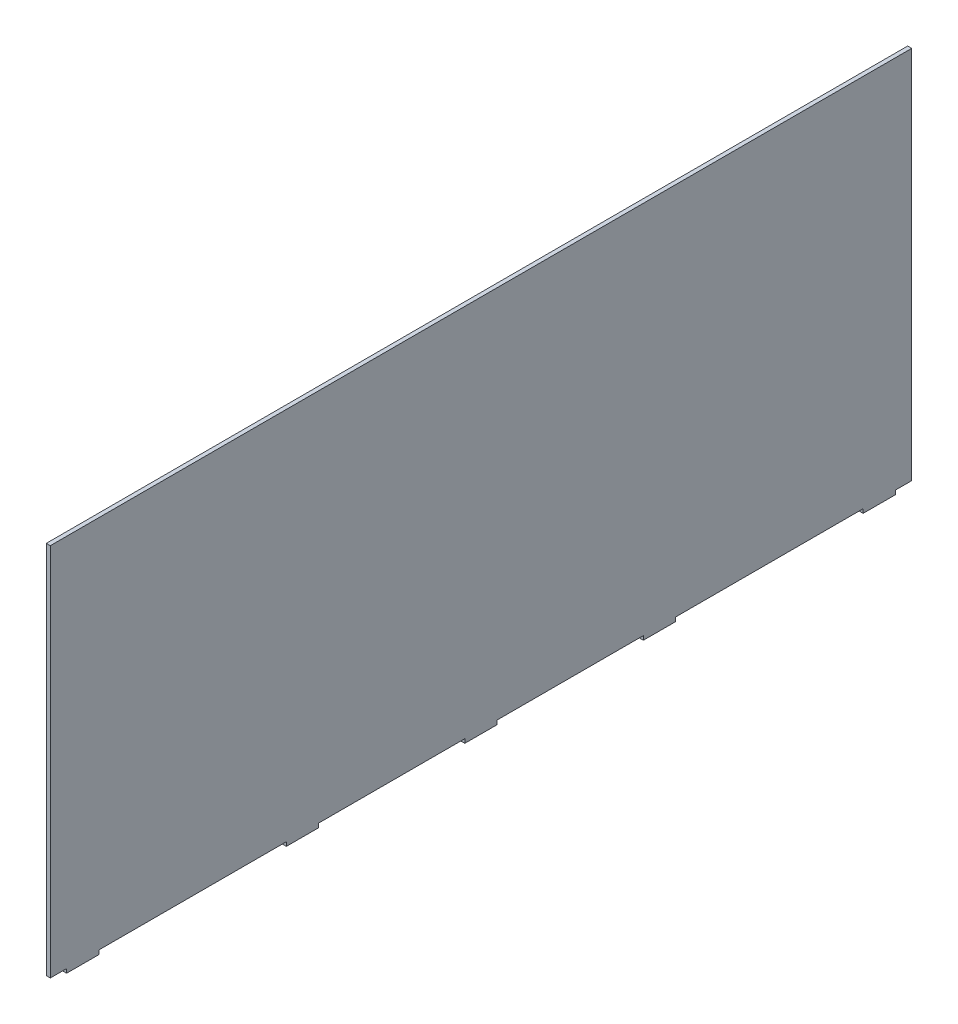
ISO-10303-21;
HEADER;
FILE_DESCRIPTION(('STEP AP214'),'2;1');
FILE_NAME('part.step','',(''),(''),'','','');
FILE_SCHEMA(('AUTOMOTIVE_DESIGN { 1 0 10303 214 1 1 1 1 }'));
ENDSEC;
DATA;
#1=APPLICATION_CONTEXT('core data for automotive mechanical design processes');
#2=APPLICATION_PROTOCOL_DEFINITION('international standard','automotive_design',2000,#1);
#3=PRODUCT_CONTEXT('',#1,'mechanical');
#4=PRODUCT('Part','Part','',(#3));
#5=PRODUCT_RELATED_PRODUCT_CATEGORY('part','',(#4));
#6=PRODUCT_DEFINITION_FORMATION('','',#4);
#7=PRODUCT_DEFINITION_CONTEXT('part definition',#1,'design');
#8=PRODUCT_DEFINITION('design','',#6,#7);
#9=PRODUCT_DEFINITION_SHAPE('','',#8);
#10=(LENGTH_UNIT() NAMED_UNIT(*) SI_UNIT(.MILLI.,.METRE.));
#11=(NAMED_UNIT(*) PLANE_ANGLE_UNIT() SI_UNIT($,.RADIAN.));
#12=(NAMED_UNIT(*) SI_UNIT($,.STERADIAN.) SOLID_ANGLE_UNIT());
#13=UNCERTAINTY_MEASURE_WITH_UNIT(LENGTH_MEASURE(1.E-05),#10,'distance_accuracy_value','');
#14=(GEOMETRIC_REPRESENTATION_CONTEXT(3) GLOBAL_UNCERTAINTY_ASSIGNED_CONTEXT((#13)) GLOBAL_UNIT_ASSIGNED_CONTEXT((#10,
#11,#12)) REPRESENTATION_CONTEXT('',''));
#15=CARTESIAN_POINT('',(0.,0.,0.));
#16=DIRECTION('',(0.,0.,1.));
#17=DIRECTION('',(1.,0.,0.));
#18=AXIS2_PLACEMENT_3D('',#15,#16,#17);
#19=CARTESIAN_POINT('',(3.175,0.,300.04258));
#20=DIRECTION('',(0.,0.,-1.));
#21=DIRECTION('',(-1.,0.,0.));
#22=AXIS2_PLACEMENT_3D('',#19,#20,#21);
#23=PLANE('',#22);
#24=DIRECTION('',(0.,-1.,0.));
#25=VECTOR('',#24,1.);
#26=CARTESIAN_POINT('',(0.,0.,300.04258));
#27=LINE('',#26,#25);
#28=CARTESIAN_POINT('',(0.,-145.415,300.04258));
#29=VERTEX_POINT('',#28);
#30=CARTESIAN_POINT('',(0.,-148.59,300.04258));
#31=VERTEX_POINT('',#30);
#32=EDGE_CURVE('E227',#29,#31,#27,.T.);
#33=ORIENTED_EDGE('',*,*,#32,.F.);
#34=DIRECTION('',(-1.,0.,0.));
#35=VECTOR('',#34,1.);
#36=CARTESIAN_POINT('',(3.175,-145.415,300.04258));
#37=LINE('',#36,#35);
#38=CARTESIAN_POINT('',(3.175,-145.415,300.04258));
#39=VERTEX_POINT('',#38);
#40=EDGE_CURVE('E11',#39,#29,#37,.T.);
#41=ORIENTED_EDGE('',*,*,#40,.F.);
#42=DIRECTION('',(0.,-1.,0.));
#43=VECTOR('',#42,1.);
#44=CARTESIAN_POINT('',(3.175,0.,300.04258));
#45=LINE('',#44,#43);
#46=CARTESIAN_POINT('',(3.175,-148.59,300.04258));
#47=VERTEX_POINT('',#46);
#48=EDGE_CURVE('E416',#39,#47,#45,.T.);
#49=ORIENTED_EDGE('',*,*,#48,.T.);
#50=DIRECTION('',(-1.,0.,0.));
#51=VECTOR('',#50,1.);
#52=CARTESIAN_POINT('',(3.175,-148.59,300.04258));
#53=LINE('',#52,#51);
#54=EDGE_CURVE('E135',#47,#31,#53,.T.);
#55=ORIENTED_EDGE('',*,*,#54,.T.);
#56=EDGE_LOOP('',(#33,#41,#49,#55));
#57=FACE_BOUND('',#56,.T.);
#58=ADVANCED_FACE('F36',(#57),#23,.T.);
#59=CARTESIAN_POINT('',(3.175,-145.415,0.));
#60=DIRECTION('',(0.,1.,0.));
#61=DIRECTION('',(0.,0.,1.));
#62=AXIS2_PLACEMENT_3D('',#59,#60,#61);
#63=PLANE('',#62);
#64=DIRECTION('',(0.,0.,-1.));
#65=VECTOR('',#64,1.);
#66=CARTESIAN_POINT('',(0.,-145.415,0.));
#67=LINE('',#66,#65);
#68=CARTESIAN_POINT('',(0.,-145.415,152.872439999999));
#69=VERTEX_POINT('',#68);
#70=EDGE_CURVE('E230',#29,#69,#67,.T.);
#71=ORIENTED_EDGE('',*,*,#70,.T.);
#72=DIRECTION('',(-1.,0.,0.));
#73=VECTOR('',#72,1.);
#74=CARTESIAN_POINT('',(3.175,-145.415,152.872439999999));
#75=LINE('',#74,#73);
#76=CARTESIAN_POINT('',(3.175,-145.415,152.872439999999));
#77=VERTEX_POINT('',#76);
#78=EDGE_CURVE('E44',#77,#69,#75,.T.);
#79=ORIENTED_EDGE('',*,*,#78,.F.);
#80=DIRECTION('',(0.,0.,-1.));
#81=VECTOR('',#80,1.);
#82=CARTESIAN_POINT('',(3.175,-145.415,0.));
#83=LINE('',#82,#81);
#84=EDGE_CURVE('E352',#39,#77,#83,.T.);
#85=ORIENTED_EDGE('',*,*,#84,.F.);
#86=ORIENTED_EDGE('',*,*,#40,.T.);
#87=EDGE_LOOP('',(#71,#79,#85,#86));
#88=FACE_BOUND('',#87,.T.);
#89=ADVANCED_FACE('F407',(#88),#63,.F.);
#90=CARTESIAN_POINT('',(3.175,0.,152.872439999999));
#91=DIRECTION('',(0.,0.,-1.));
#92=DIRECTION('',(-1.,0.,0.));
#93=AXIS2_PLACEMENT_3D('',#90,#91,#92);
#94=PLANE('',#93);
#95=DIRECTION('',(0.,-1.,0.));
#96=VECTOR('',#95,1.);
#97=CARTESIAN_POINT('',(0.,0.,152.872439999999));
#98=LINE('',#97,#96);
#99=CARTESIAN_POINT('',(0.,-148.59,152.872439999999));
#100=VERTEX_POINT('',#99);
#101=EDGE_CURVE('E232',#69,#100,#98,.T.);
#102=ORIENTED_EDGE('',*,*,#101,.T.);
#103=DIRECTION('',(-1.,0.,0.));
#104=VECTOR('',#103,1.);
#105=CARTESIAN_POINT('',(3.175,-148.59,152.872439999999));
#106=LINE('',#105,#104);
#107=CARTESIAN_POINT('',(3.175,-148.59,152.872439999999));
#108=VERTEX_POINT('',#107);
#109=EDGE_CURVE('E324',#108,#100,#106,.T.);
#110=ORIENTED_EDGE('',*,*,#109,.F.);
#111=DIRECTION('',(0.,-1.,0.));
#112=VECTOR('',#111,1.);
#113=CARTESIAN_POINT('',(3.175,0.,152.872439999999));
#114=LINE('',#113,#112);
#115=EDGE_CURVE('E333',#77,#108,#114,.T.);
#116=ORIENTED_EDGE('',*,*,#115,.F.);
#117=ORIENTED_EDGE('',*,*,#78,.T.);
#118=EDGE_LOOP('',(#102,#110,#116,#117));
#119=FACE_BOUND('',#118,.T.);
#120=ADVANCED_FACE('F331',(#119),#94,.F.);
#121=CARTESIAN_POINT('',(3.175,-148.59,0.));
#122=DIRECTION('',(0.,1.,0.));
#123=DIRECTION('',(0.,0.,1.));
#124=AXIS2_PLACEMENT_3D('',#121,#122,#123);
#125=PLANE('',#124);
#126=DIRECTION('',(0.,0.,-1.));
#127=VECTOR('',#126,1.);
#128=CARTESIAN_POINT('',(0.,-148.59,0.));
#129=LINE('',#128,#127);
#130=CARTESIAN_POINT('',(0.,-148.59,127.472439999999));
#131=VERTEX_POINT('',#130);
#132=EDGE_CURVE('E236',#100,#131,#129,.T.);
#133=ORIENTED_EDGE('',*,*,#132,.T.);
#134=DIRECTION('',(-1.,0.,0.));
#135=VECTOR('',#134,1.);
#136=CARTESIAN_POINT('',(3.175,-148.59,127.472439999999));
#137=LINE('',#136,#135);
#138=CARTESIAN_POINT('',(3.175,-148.59,127.472439999999));
#139=VERTEX_POINT('',#138);
#140=EDGE_CURVE('E322',#139,#131,#137,.T.);
#141=ORIENTED_EDGE('',*,*,#140,.F.);
#142=DIRECTION('',(0.,0.,-1.));
#143=VECTOR('',#142,1.);
#144=CARTESIAN_POINT('',(3.175,-148.59,0.));
#145=LINE('',#144,#143);
#146=EDGE_CURVE('E346',#108,#139,#145,.T.);
#147=ORIENTED_EDGE('',*,*,#146,.F.);
#148=ORIENTED_EDGE('',*,*,#109,.T.);
#149=EDGE_LOOP('',(#133,#141,#147,#148));
#150=FACE_BOUND('',#149,.T.);
#151=ADVANCED_FACE('F343',(#150),#125,.F.);
#152=CARTESIAN_POINT('',(3.175,0.,127.472439999999));
#153=DIRECTION('',(0.,0.,-1.));
#154=DIRECTION('',(-1.,0.,0.));
#155=AXIS2_PLACEMENT_3D('',#152,#153,#154);
#156=PLANE('',#155);
#157=DIRECTION('',(0.,-1.,0.));
#158=VECTOR('',#157,1.);
#159=CARTESIAN_POINT('',(0.,0.,127.472439999999));
#160=LINE('',#159,#158);
#161=CARTESIAN_POINT('',(0.,-145.415,127.472439999999));
#162=VERTEX_POINT('',#161);
#163=EDGE_CURVE('E239',#162,#131,#160,.T.);
#164=ORIENTED_EDGE('',*,*,#163,.F.);
#165=DIRECTION('',(-1.,0.,0.));
#166=VECTOR('',#165,1.);
#167=CARTESIAN_POINT('',(3.175,-145.415,127.472439999999));
#168=LINE('',#167,#166);
#169=CARTESIAN_POINT('',(3.175,-145.415,127.472439999999));
#170=VERTEX_POINT('',#169);
#171=EDGE_CURVE('E320',#170,#162,#168,.T.);
#172=ORIENTED_EDGE('',*,*,#171,.F.);
#173=DIRECTION('',(0.,-1.,0.));
#174=VECTOR('',#173,1.);
#175=CARTESIAN_POINT('',(3.175,0.,127.472439999999));
#176=LINE('',#175,#174);
#177=EDGE_CURVE('E348',#170,#139,#176,.T.);
#178=ORIENTED_EDGE('',*,*,#177,.T.);
#179=ORIENTED_EDGE('',*,*,#140,.T.);
#180=EDGE_LOOP('',(#164,#172,#178,#179));
#181=FACE_BOUND('',#180,.T.);
#182=ADVANCED_FACE('F485',(#181),#156,.T.);
#183=CARTESIAN_POINT('',(0.,-145.415,12.7000000000002));
#184=VERTEX_POINT('',#183);
#185=EDGE_CURVE('E234',#162,#184,#67,.T.);
#186=ORIENTED_EDGE('',*,*,#185,.T.);
#187=DIRECTION('',(-1.,0.,0.));
#188=VECTOR('',#187,1.);
#189=CARTESIAN_POINT('',(3.175,-145.415,12.7000000000002));
#190=LINE('',#189,#188);
#191=CARTESIAN_POINT('',(3.175,-145.415,12.7000000000002));
#192=VERTEX_POINT('',#191);
#193=EDGE_CURVE('E317',#192,#184,#190,.T.);
#194=ORIENTED_EDGE('',*,*,#193,.F.);
#195=EDGE_CURVE('E350',#170,#192,#83,.T.);
#196=ORIENTED_EDGE('',*,*,#195,.F.);
#197=ORIENTED_EDGE('',*,*,#171,.T.);
#198=EDGE_LOOP('',(#186,#194,#196,#197));
#199=FACE_BOUND('',#198,.T.);
#200=ADVANCED_FACE('F412',(#199),#63,.F.);
#201=CARTESIAN_POINT('',(3.175,0.,12.7000000000002));
#202=DIRECTION('',(0.,0.,-1.));
#203=DIRECTION('',(-1.,0.,0.));
#204=AXIS2_PLACEMENT_3D('',#201,#202,#203);
#205=PLANE('',#204);
#206=DIRECTION('',(0.,-1.,0.));
#207=VECTOR('',#206,1.);
#208=CARTESIAN_POINT('',(0.,0.,12.7000000000002));
#209=LINE('',#208,#207);
#210=CARTESIAN_POINT('',(0.,-148.59,12.7000000000002));
#211=VERTEX_POINT('',#210);
#212=EDGE_CURVE('E242',#184,#211,#209,.T.);
#213=ORIENTED_EDGE('',*,*,#212,.T.);
#214=DIRECTION('',(-1.,0.,0.));
#215=VECTOR('',#214,1.);
#216=CARTESIAN_POINT('',(3.175,-148.59,12.7000000000002));
#217=LINE('',#216,#215);
#218=CARTESIAN_POINT('',(3.175,-148.59,12.7000000000002));
#219=VERTEX_POINT('',#218);
#220=EDGE_CURVE('E314',#219,#211,#217,.T.);
#221=ORIENTED_EDGE('',*,*,#220,.F.);
#222=DIRECTION('',(0.,-1.,0.));
#223=VECTOR('',#222,1.);
#224=CARTESIAN_POINT('',(3.175,0.,12.7000000000002));
#225=LINE('',#224,#223);
#226=EDGE_CURVE('E356',#192,#219,#225,.T.);
#227=ORIENTED_EDGE('',*,*,#226,.F.);
#228=ORIENTED_EDGE('',*,*,#193,.T.);
#229=EDGE_LOOP('',(#213,#221,#227,#228));
#230=FACE_BOUND('',#229,.T.);
#231=ADVANCED_FACE('F463',(#230),#205,.F.);
#232=CARTESIAN_POINT('',(3.175,-148.59,0.));
#233=DIRECTION('',(0.,1.,0.));
#234=DIRECTION('',(0.,0.,1.));
#235=AXIS2_PLACEMENT_3D('',#232,#233,#234);
#236=PLANE('',#235);
#237=DIRECTION('',(0.,0.,-1.));
#238=VECTOR('',#237,1.);
#239=CARTESIAN_POINT('',(0.,-148.59,0.));
#240=LINE('',#239,#238);
#241=CARTESIAN_POINT('',(0.,-148.59,-12.7));
#242=VERTEX_POINT('',#241);
#243=EDGE_CURVE('E244',#211,#242,#240,.T.);
#244=ORIENTED_EDGE('',*,*,#243,.T.);
#245=DIRECTION('',(-1.,0.,0.));
#246=VECTOR('',#245,1.);
#247=CARTESIAN_POINT('',(3.175,-148.59,-12.7));
#248=LINE('',#247,#246);
#249=CARTESIAN_POINT('',(3.175,-148.59,-12.7));
#250=VERTEX_POINT('',#249);
#251=EDGE_CURVE('E312',#250,#242,#248,.T.);
#252=ORIENTED_EDGE('',*,*,#251,.F.);
#253=DIRECTION('',(0.,0.,-1.));
#254=VECTOR('',#253,1.);
#255=CARTESIAN_POINT('',(3.175,-148.59,0.));
#256=LINE('',#255,#254);
#257=EDGE_CURVE('E358',#219,#250,#256,.T.);
#258=ORIENTED_EDGE('',*,*,#257,.F.);
#259=ORIENTED_EDGE('',*,*,#220,.T.);
#260=EDGE_LOOP('',(#244,#252,#258,#259));
#261=FACE_BOUND('',#260,.T.);
#262=ADVANCED_FACE('F469',(#261),#236,.F.);
#263=CARTESIAN_POINT('',(3.175,1.6653345369352E-12,-12.6999999999807));
#264=DIRECTION('',(0.,1.31128703695884E-13,-1.));
#265=DIRECTION('',(0.,1.,1.31128703695884E-13));
#266=AXIS2_PLACEMENT_3D('',#263,#264,#265);
#267=PLANE('',#266);
#268=DIRECTION('',(0.,-1.,-1.31128703695884E-13));
#269=VECTOR('',#268,1.);
#270=CARTESIAN_POINT('',(0.,1.6653345369352E-12,-12.6999999999807));
#271=LINE('',#270,#269);
#272=CARTESIAN_POINT('',(0.,-145.415,-12.6999999999998));
#273=VERTEX_POINT('',#272);
#274=EDGE_CURVE('E247',#273,#242,#271,.T.);
#275=ORIENTED_EDGE('',*,*,#274,.F.);
#276=DIRECTION('',(-1.,0.,0.));
#277=VECTOR('',#276,1.);
#278=CARTESIAN_POINT('',(3.175,-145.415,-12.6999999999998));
#279=LINE('',#278,#277);
#280=CARTESIAN_POINT('',(3.175,-145.415,-12.6999999999998));
#281=VERTEX_POINT('',#280);
#282=EDGE_CURVE('E310',#281,#273,#279,.T.);
#283=ORIENTED_EDGE('',*,*,#282,.F.);
#284=DIRECTION('',(0.,-1.,-1.31128703695884E-13));
#285=VECTOR('',#284,1.);
#286=CARTESIAN_POINT('',(3.175,1.6653345369352E-12,-12.6999999999807));
#287=LINE('',#286,#285);
#288=EDGE_CURVE('E360',#281,#250,#287,.T.);
#289=ORIENTED_EDGE('',*,*,#288,.T.);
#290=ORIENTED_EDGE('',*,*,#251,.T.);
#291=EDGE_LOOP('',(#275,#283,#289,#290));
#292=FACE_BOUND('',#291,.T.);
#293=ADVANCED_FACE('F472',(#292),#267,.T.);
#294=CARTESIAN_POINT('',(0.,-145.415,-127.472439999999));
#295=VERTEX_POINT('',#294);
#296=EDGE_CURVE('E250',#273,#295,#67,.T.);
#297=ORIENTED_EDGE('',*,*,#296,.T.);
#298=DIRECTION('',(-1.,0.,0.));
#299=VECTOR('',#298,1.);
#300=CARTESIAN_POINT('',(3.175,-145.415,-127.472439999999));
#301=LINE('',#300,#299);
#302=CARTESIAN_POINT('',(3.175,-145.415,-127.472439999999));
#303=VERTEX_POINT('',#302);
#304=EDGE_CURVE('E307',#303,#295,#301,.T.);
#305=ORIENTED_EDGE('',*,*,#304,.F.);
#306=EDGE_CURVE('E363',#281,#303,#83,.T.);
#307=ORIENTED_EDGE('',*,*,#306,.F.);
#308=ORIENTED_EDGE('',*,*,#282,.T.);
#309=EDGE_LOOP('',(#297,#305,#307,#308));
#310=FACE_BOUND('',#309,.T.);
#311=ADVANCED_FACE('F426',(#310),#63,.F.);
#312=CARTESIAN_POINT('',(3.175,0.,-127.472439999999));
#313=DIRECTION('',(0.,0.,-1.));
#314=DIRECTION('',(-1.,0.,0.));
#315=AXIS2_PLACEMENT_3D('',#312,#313,#314);
#316=PLANE('',#315);
#317=DIRECTION('',(0.,-1.,0.));
#318=VECTOR('',#317,1.);
#319=CARTESIAN_POINT('',(0.,0.,-127.472439999999));
#320=LINE('',#319,#318);
#321=CARTESIAN_POINT('',(0.,-148.59,-127.472439999999));
#322=VERTEX_POINT('',#321);
#323=EDGE_CURVE('E251',#295,#322,#320,.T.);
#324=ORIENTED_EDGE('',*,*,#323,.T.);
#325=DIRECTION('',(-1.,0.,0.));
#326=VECTOR('',#325,1.);
#327=CARTESIAN_POINT('',(3.175,-148.59,-127.472439999999));
#328=LINE('',#327,#326);
#329=CARTESIAN_POINT('',(3.175,-148.59,-127.472439999999));
#330=VERTEX_POINT('',#329);
#331=EDGE_CURVE('E304',#330,#322,#328,.T.);
#332=ORIENTED_EDGE('',*,*,#331,.F.);
#333=DIRECTION('',(0.,-1.,0.));
#334=VECTOR('',#333,1.);
#335=CARTESIAN_POINT('',(3.175,0.,-127.472439999999));
#336=LINE('',#335,#334);
#337=EDGE_CURVE('E364',#303,#330,#336,.T.);
#338=ORIENTED_EDGE('',*,*,#337,.F.);
#339=ORIENTED_EDGE('',*,*,#304,.T.);
#340=EDGE_LOOP('',(#324,#332,#338,#339));
#341=FACE_BOUND('',#340,.T.);
#342=ADVANCED_FACE('F430',(#341),#316,.F.);
#343=CARTESIAN_POINT('',(3.175,-148.59,0.));
#344=DIRECTION('',(0.,1.,0.));
#345=DIRECTION('',(0.,0.,1.));
#346=AXIS2_PLACEMENT_3D('',#343,#344,#345);
#347=PLANE('',#346);
#348=DIRECTION('',(0.,0.,-1.));
#349=VECTOR('',#348,1.);
#350=CARTESIAN_POINT('',(0.,-148.59,0.));
#351=LINE('',#350,#349);
#352=CARTESIAN_POINT('',(0.,-148.59,-152.872439999999));
#353=VERTEX_POINT('',#352);
#354=EDGE_CURVE('E253',#322,#353,#351,.T.);
#355=ORIENTED_EDGE('',*,*,#354,.T.);
#356=DIRECTION('',(-1.,0.,0.));
#357=VECTOR('',#356,1.);
#358=CARTESIAN_POINT('',(3.175,-148.59,-152.872439999999));
#359=LINE('',#358,#357);
#360=CARTESIAN_POINT('',(3.175,-148.59,-152.872439999999));
#361=VERTEX_POINT('',#360);
#362=EDGE_CURVE('E302',#361,#353,#359,.T.);
#363=ORIENTED_EDGE('',*,*,#362,.F.);
#364=DIRECTION('',(0.,0.,-1.));
#365=VECTOR('',#364,1.);
#366=CARTESIAN_POINT('',(3.175,-148.59,0.));
#367=LINE('',#366,#365);
#368=EDGE_CURVE('E366',#330,#361,#367,.T.);
#369=ORIENTED_EDGE('',*,*,#368,.F.);
#370=ORIENTED_EDGE('',*,*,#331,.T.);
#371=EDGE_LOOP('',(#355,#363,#369,#370));
#372=FACE_BOUND('',#371,.T.);
#373=ADVANCED_FACE('F435',(#372),#347,.F.);
#374=CARTESIAN_POINT('',(3.175,0.,-152.872439999999));
#375=DIRECTION('',(0.,0.,-1.));
#376=DIRECTION('',(-1.,0.,0.));
#377=AXIS2_PLACEMENT_3D('',#374,#375,#376);
#378=PLANE('',#377);
#379=DIRECTION('',(0.,-1.,0.));
#380=VECTOR('',#379,1.);
#381=CARTESIAN_POINT('',(0.,0.,-152.872439999999));
#382=LINE('',#381,#380);
#383=CARTESIAN_POINT('',(0.,-145.415,-152.872439999999));
#384=VERTEX_POINT('',#383);
#385=EDGE_CURVE('E256',#384,#353,#382,.T.);
#386=ORIENTED_EDGE('',*,*,#385,.F.);
#387=DIRECTION('',(-1.,0.,0.));
#388=VECTOR('',#387,1.);
#389=CARTESIAN_POINT('',(3.175,-145.415,-152.872439999999));
#390=LINE('',#389,#388);
#391=CARTESIAN_POINT('',(3.175,-145.415,-152.872439999999));
#392=VERTEX_POINT('',#391);
#393=EDGE_CURVE('E300',#392,#384,#390,.T.);
#394=ORIENTED_EDGE('',*,*,#393,.F.);
#395=DIRECTION('',(0.,-1.,0.));
#396=VECTOR('',#395,1.);
#397=CARTESIAN_POINT('',(3.175,0.,-152.872439999999));
#398=LINE('',#397,#396);
#399=EDGE_CURVE('E368',#392,#361,#398,.T.);
#400=ORIENTED_EDGE('',*,*,#399,.T.);
#401=ORIENTED_EDGE('',*,*,#362,.T.);
#402=EDGE_LOOP('',(#386,#394,#400,#401));
#403=FACE_BOUND('',#402,.T.);
#404=ADVANCED_FACE('F441',(#403),#378,.T.);
#405=CARTESIAN_POINT('',(0.,-145.415,-300.04258));
#406=VERTEX_POINT('',#405);
#407=EDGE_CURVE('E233',#384,#406,#67,.T.);
#408=ORIENTED_EDGE('',*,*,#407,.T.);
#409=DIRECTION('',(-1.,0.,0.));
#410=VECTOR('',#409,1.);
#411=CARTESIAN_POINT('',(3.175,-145.415,-300.04258));
#412=LINE('',#411,#410);
#413=CARTESIAN_POINT('',(3.175,-145.415,-300.04258));
#414=VERTEX_POINT('',#413);
#415=EDGE_CURVE('E297',#414,#406,#412,.T.);
#416=ORIENTED_EDGE('',*,*,#415,.F.);
#417=EDGE_CURVE('E371',#392,#414,#83,.T.);
#418=ORIENTED_EDGE('',*,*,#417,.F.);
#419=ORIENTED_EDGE('',*,*,#393,.T.);
#420=EDGE_LOOP('',(#408,#416,#418,#419));
#421=FACE_BOUND('',#420,.T.);
#422=ADVANCED_FACE('F413',(#421),#63,.F.);
#423=CARTESIAN_POINT('',(3.175,0.,-300.04258));
#424=DIRECTION('',(0.,0.,-1.));
#425=DIRECTION('',(-1.,0.,0.));
#426=AXIS2_PLACEMENT_3D('',#423,#424,#425);
#427=PLANE('',#426);
#428=DIRECTION('',(0.,-1.,0.));
#429=VECTOR('',#428,1.);
#430=CARTESIAN_POINT('',(0.,0.,-300.04258));
#431=LINE('',#430,#429);
#432=CARTESIAN_POINT('',(0.,-148.59,-300.04258));
#433=VERTEX_POINT('',#432);
#434=EDGE_CURVE('E259',#406,#433,#431,.T.);
#435=ORIENTED_EDGE('',*,*,#434,.T.);
#436=DIRECTION('',(-1.,0.,0.));
#437=VECTOR('',#436,1.);
#438=CARTESIAN_POINT('',(3.175,-148.59,-300.04258));
#439=LINE('',#438,#437);
#440=CARTESIAN_POINT('',(3.175,-148.59,-300.04258));
#441=VERTEX_POINT('',#440);
#442=EDGE_CURVE('E294',#441,#433,#439,.T.);
#443=ORIENTED_EDGE('',*,*,#442,.F.);
#444=DIRECTION('',(0.,-1.,0.));
#445=VECTOR('',#444,1.);
#446=CARTESIAN_POINT('',(3.175,0.,-300.04258));
#447=LINE('',#446,#445);
#448=EDGE_CURVE('E372',#414,#441,#447,.T.);
#449=ORIENTED_EDGE('',*,*,#448,.F.);
#450=ORIENTED_EDGE('',*,*,#415,.T.);
#451=EDGE_LOOP('',(#435,#443,#449,#450));
#452=FACE_BOUND('',#451,.T.);
#453=ADVANCED_FACE('F448',(#452),#427,.F.);
#454=CARTESIAN_POINT('',(3.175,-148.59,0.));
#455=DIRECTION('',(0.,1.,0.));
#456=DIRECTION('',(0.,0.,1.));
#457=AXIS2_PLACEMENT_3D('',#454,#455,#456);
#458=PLANE('',#457);
#459=DIRECTION('',(0.,0.,-1.));
#460=VECTOR('',#459,1.);
#461=CARTESIAN_POINT('',(0.,-148.59,0.));
#462=LINE('',#461,#460);
#463=CARTESIAN_POINT('',(0.,-148.59,-325.44258));
#464=VERTEX_POINT('',#463);
#465=EDGE_CURVE('E261',#433,#464,#462,.T.);
#466=ORIENTED_EDGE('',*,*,#465,.T.);
#467=DIRECTION('',(-1.,0.,0.));
#468=VECTOR('',#467,1.);
#469=CARTESIAN_POINT('',(3.175,-148.59,-325.44258));
#470=LINE('',#469,#468);
#471=CARTESIAN_POINT('',(3.175,-148.59,-325.44258));
#472=VERTEX_POINT('',#471);
#473=EDGE_CURVE('E292',#472,#464,#470,.T.);
#474=ORIENTED_EDGE('',*,*,#473,.F.);
#475=DIRECTION('',(0.,0.,-1.));
#476=VECTOR('',#475,1.);
#477=CARTESIAN_POINT('',(3.175,-148.59,0.));
#478=LINE('',#477,#476);
#479=EDGE_CURVE('E224',#441,#472,#478,.T.);
#480=ORIENTED_EDGE('',*,*,#479,.F.);
#481=ORIENTED_EDGE('',*,*,#442,.T.);
#482=EDGE_LOOP('',(#466,#474,#480,#481));
#483=FACE_BOUND('',#482,.T.);
#484=ADVANCED_FACE('F452',(#483),#458,.F.);
#485=CARTESIAN_POINT('',(3.175,3.98298727333189E-11,-325.442579999982));
#486=DIRECTION('',(0.,1.22386790116159E-13,-1.));
#487=DIRECTION('',(0.,1.,1.22386790116159E-13));
#488=AXIS2_PLACEMENT_3D('',#485,#486,#487);
#489=PLANE('',#488);
#490=DIRECTION('',(0.,-1.,-1.22386790116159E-13));
#491=VECTOR('',#490,1.);
#492=CARTESIAN_POINT('',(0.,3.98298727333189E-11,-325.442579999982));
#493=LINE('',#492,#491);
#494=CARTESIAN_POINT('',(0.,-145.415,-325.44258));
#495=VERTEX_POINT('',#494);
#496=EDGE_CURVE('E264',#495,#464,#493,.T.);
#497=ORIENTED_EDGE('',*,*,#496,.F.);
#498=DIRECTION('',(-1.,0.,0.));
#499=VECTOR('',#498,1.);
#500=CARTESIAN_POINT('',(3.175,-145.415,-325.44258));
#501=LINE('',#500,#499);
#502=CARTESIAN_POINT('',(3.175,-145.415,-325.44258));
#503=VERTEX_POINT('',#502);
#504=EDGE_CURVE('E290',#503,#495,#501,.T.);
#505=ORIENTED_EDGE('',*,*,#504,.F.);
#506=DIRECTION('',(0.,-1.,-1.22386790116159E-13));
#507=VECTOR('',#506,1.);
#508=CARTESIAN_POINT('',(3.175,3.98298727333189E-11,-325.442579999982));
#509=LINE('',#508,#507);
#510=EDGE_CURVE('E374',#503,#472,#509,.T.);
#511=ORIENTED_EDGE('',*,*,#510,.T.);
#512=ORIENTED_EDGE('',*,*,#473,.T.);
#513=EDGE_LOOP('',(#497,#505,#511,#512));
#514=FACE_BOUND('',#513,.T.);
#515=ADVANCED_FACE('F456',(#514),#489,.T.);
#516=CARTESIAN_POINT('',(3.175,-145.415,0.));
#517=DIRECTION('',(0.,1.,0.));
#518=DIRECTION('',(0.,0.,1.));
#519=AXIS2_PLACEMENT_3D('',#516,#517,#518);
#520=PLANE('',#519);
#521=DIRECTION('',(0.,0.,-1.));
#522=VECTOR('',#521,1.);
#523=CARTESIAN_POINT('',(0.,-145.415,0.));
#524=LINE('',#523,#522);
#525=CARTESIAN_POINT('',(0.,-145.415,-338.201));
#526=VERTEX_POINT('',#525);
#527=EDGE_CURVE('E268',#495,#526,#524,.T.);
#528=ORIENTED_EDGE('',*,*,#527,.T.);
#529=DIRECTION('',(-1.,0.,0.));
#530=VECTOR('',#529,1.);
#531=CARTESIAN_POINT('',(3.175,-145.415,-338.201));
#532=LINE('',#531,#530);
#533=CARTESIAN_POINT('',(3.175,-145.415,-338.201));
#534=VERTEX_POINT('',#533);
#535=EDGE_CURVE('E288',#534,#526,#532,.T.);
#536=ORIENTED_EDGE('',*,*,#535,.F.);
#537=DIRECTION('',(0.,0.,-1.));
#538=VECTOR('',#537,1.);
#539=CARTESIAN_POINT('',(3.175,-145.415,0.));
#540=LINE('',#539,#538);
#541=EDGE_CURVE('E377',#503,#534,#540,.T.);
#542=ORIENTED_EDGE('',*,*,#541,.F.);
#543=ORIENTED_EDGE('',*,*,#504,.T.);
#544=EDGE_LOOP('',(#528,#536,#542,#543));
#545=FACE_BOUND('',#544,.T.);
#546=ADVANCED_FACE('F458',(#545),#520,.F.);
#547=CARTESIAN_POINT('',(3.175,0.,-338.201));
#548=DIRECTION('',(0.,0.,-1.));
#549=DIRECTION('',(-1.,0.,0.));
#550=AXIS2_PLACEMENT_3D('',#547,#548,#549);
#551=PLANE('',#550);
#552=DIRECTION('',(0.,-1.,0.));
#553=VECTOR('',#552,1.);
#554=CARTESIAN_POINT('',(0.,0.,-338.201));
#555=LINE('',#554,#553);
#556=CARTESIAN_POINT('',(0.,148.59,-338.201));
#557=VERTEX_POINT('',#556);
#558=EDGE_CURVE('E271',#557,#526,#555,.T.);
#559=ORIENTED_EDGE('',*,*,#558,.F.);
#560=DIRECTION('',(-1.,0.,0.));
#561=VECTOR('',#560,1.);
#562=CARTESIAN_POINT('',(3.175,148.59,-338.201));
#563=LINE('',#562,#561);
#564=CARTESIAN_POINT('',(3.175,148.59,-338.201));
#565=VERTEX_POINT('',#564);
#566=EDGE_CURVE('E286',#565,#557,#563,.T.);
#567=ORIENTED_EDGE('',*,*,#566,.F.);
#568=DIRECTION('',(0.,-1.,0.));
#569=VECTOR('',#568,1.);
#570=CARTESIAN_POINT('',(3.175,0.,-338.201));
#571=LINE('',#570,#569);
#572=EDGE_CURVE('E379',#565,#534,#571,.T.);
#573=ORIENTED_EDGE('',*,*,#572,.T.);
#574=ORIENTED_EDGE('',*,*,#535,.T.);
#575=EDGE_LOOP('',(#559,#567,#573,#574));
#576=FACE_BOUND('',#575,.T.);
#577=ADVANCED_FACE('F393',(#576),#551,.T.);
#578=CARTESIAN_POINT('',(3.175,148.59,0.));
#579=DIRECTION('',(0.,1.,0.));
#580=DIRECTION('',(0.,0.,1.));
#581=AXIS2_PLACEMENT_3D('',#578,#579,#580);
#582=PLANE('',#581);
#583=DIRECTION('',(0.,0.,-1.));
#584=VECTOR('',#583,1.);
#585=CARTESIAN_POINT('',(0.,148.59,0.));
#586=LINE('',#585,#584);
#587=CARTESIAN_POINT('',(0.,148.59,338.201));
#588=VERTEX_POINT('',#587);
#589=EDGE_CURVE('E274',#588,#557,#586,.T.);
#590=ORIENTED_EDGE('',*,*,#589,.F.);
#591=DIRECTION('',(-1.,0.,0.));
#592=VECTOR('',#591,1.);
#593=CARTESIAN_POINT('',(3.175,148.59,338.201));
#594=LINE('',#593,#592);
#595=CARTESIAN_POINT('',(3.175,148.59,338.201));
#596=VERTEX_POINT('',#595);
#597=EDGE_CURVE('E284',#596,#588,#594,.T.);
#598=ORIENTED_EDGE('',*,*,#597,.F.);
#599=DIRECTION('',(0.,0.,-1.));
#600=VECTOR('',#599,1.);
#601=CARTESIAN_POINT('',(3.175,148.59,0.));
#602=LINE('',#601,#600);
#603=EDGE_CURVE('E382',#596,#565,#602,.T.);
#604=ORIENTED_EDGE('',*,*,#603,.T.);
#605=ORIENTED_EDGE('',*,*,#566,.T.);
#606=EDGE_LOOP('',(#590,#598,#604,#605));
#607=FACE_BOUND('',#606,.T.);
#608=ADVANCED_FACE('F386',(#607),#582,.T.);
#609=CARTESIAN_POINT('',(3.175,0.,338.201));
#610=DIRECTION('',(0.,0.,-1.));
#611=DIRECTION('',(-1.,0.,0.));
#612=AXIS2_PLACEMENT_3D('',#609,#610,#611);
#613=PLANE('',#612);
#614=DIRECTION('',(0.,-1.,0.));
#615=VECTOR('',#614,1.);
#616=CARTESIAN_POINT('',(0.,0.,338.201));
#617=LINE('',#616,#615);
#618=CARTESIAN_POINT('',(0.,-145.415,338.201));
#619=VERTEX_POINT('',#618);
#620=EDGE_CURVE('E277',#588,#619,#617,.T.);
#621=ORIENTED_EDGE('',*,*,#620,.T.);
#622=DIRECTION('',(-1.,0.,0.));
#623=VECTOR('',#622,1.);
#624=CARTESIAN_POINT('',(3.175,-145.415,338.201));
#625=LINE('',#624,#623);
#626=CARTESIAN_POINT('',(3.175,-145.415,338.201));
#627=VERTEX_POINT('',#626);
#628=EDGE_CURVE('E218',#627,#619,#625,.T.);
#629=ORIENTED_EDGE('',*,*,#628,.F.);
#630=DIRECTION('',(0.,-1.,0.));
#631=VECTOR('',#630,1.);
#632=CARTESIAN_POINT('',(3.175,0.,338.201));
#633=LINE('',#632,#631);
#634=EDGE_CURVE('E209',#596,#627,#633,.T.);
#635=ORIENTED_EDGE('',*,*,#634,.F.);
#636=ORIENTED_EDGE('',*,*,#597,.T.);
#637=EDGE_LOOP('',(#621,#629,#635,#636));
#638=FACE_BOUND('',#637,.T.);
#639=ADVANCED_FACE('F397',(#638),#613,.F.);
#640=CARTESIAN_POINT('',(3.175,-145.415000000002,9.4903844554735E-13));
#641=DIRECTION('',(0.,1.,0.));
#642=DIRECTION('',(0.,0.,1.));
#643=AXIS2_PLACEMENT_3D('',#640,#641,#642);
#644=PLANE('',#643);
#645=DIRECTION('',(0.,0.,-1.));
#646=VECTOR('',#645,1.);
#647=CARTESIAN_POINT('',(0.,-145.415000000002,9.4903844554735E-13));
#648=LINE('',#647,#646);
#649=CARTESIAN_POINT('',(0.,-145.415,325.44258));
#650=VERTEX_POINT('',#649);
#651=EDGE_CURVE('E217',#619,#650,#648,.T.);
#652=ORIENTED_EDGE('',*,*,#651,.T.);
#653=DIRECTION('',(-1.,0.,0.));
#654=VECTOR('',#653,1.);
#655=CARTESIAN_POINT('',(3.175,-145.415,325.44258));
#656=LINE('',#655,#654);
#657=CARTESIAN_POINT('',(3.175,-145.415,325.44258));
#658=VERTEX_POINT('',#657);
#659=EDGE_CURVE('E214',#658,#650,#656,.T.);
#660=ORIENTED_EDGE('',*,*,#659,.F.);
#661=DIRECTION('',(0.,0.,-1.));
#662=VECTOR('',#661,1.);
#663=CARTESIAN_POINT('',(3.175,-145.415000000002,9.4903844554735E-13));
#664=LINE('',#663,#662);
#665=EDGE_CURVE('E202',#627,#658,#664,.T.);
#666=ORIENTED_EDGE('',*,*,#665,.F.);
#667=ORIENTED_EDGE('',*,*,#628,.T.);
#668=EDGE_LOOP('',(#652,#660,#666,#667));
#669=FACE_BOUND('',#668,.T.);
#670=ADVANCED_FACE('F215',(#669),#644,.F.);
#671=CARTESIAN_POINT('',(3.175,3.98298727333189E-11,325.442579999982));
#672=DIRECTION('',(0.,-1.22386790116159E-13,-1.));
#673=DIRECTION('',(0.,1.,-1.22386790116159E-13));
#674=AXIS2_PLACEMENT_3D('',#671,#672,#673);
#675=PLANE('',#674);
#676=DIRECTION('',(0.,-1.,1.22386790116159E-13));
#677=VECTOR('',#676,1.);
#678=CARTESIAN_POINT('',(0.,3.98298727333189E-11,325.442579999982));
#679=LINE('',#678,#677);
#680=CARTESIAN_POINT('',(0.,-148.59,325.44258));
#681=VERTEX_POINT('',#680);
#682=EDGE_CURVE('E128',#650,#681,#679,.T.);
#683=ORIENTED_EDGE('',*,*,#682,.T.);
#684=DIRECTION('',(-1.,0.,0.));
#685=VECTOR('',#684,1.);
#686=CARTESIAN_POINT('',(3.175,-148.59,325.44258));
#687=LINE('',#686,#685);
#688=CARTESIAN_POINT('',(3.175,-148.59,325.44258));
#689=VERTEX_POINT('',#688);
#690=EDGE_CURVE('E219',#689,#681,#687,.T.);
#691=ORIENTED_EDGE('',*,*,#690,.F.);
#692=DIRECTION('',(0.,-1.,1.22386790116159E-13));
#693=VECTOR('',#692,1.);
#694=CARTESIAN_POINT('',(3.175,3.98298727333189E-11,325.442579999982));
#695=LINE('',#694,#693);
#696=EDGE_CURVE('E206',#658,#689,#695,.T.);
#697=ORIENTED_EDGE('',*,*,#696,.F.);
#698=ORIENTED_EDGE('',*,*,#659,.T.);
#699=EDGE_LOOP('',(#683,#691,#697,#698));
#700=FACE_BOUND('',#699,.T.);
#701=ADVANCED_FACE('F221',(#700),#675,.F.);
#702=EDGE_CURVE('E265',#681,#31,#462,.T.);
#703=ORIENTED_EDGE('',*,*,#702,.T.);
#704=ORIENTED_EDGE('',*,*,#54,.F.);
#705=EDGE_CURVE('E52',#689,#47,#478,.T.);
#706=ORIENTED_EDGE('',*,*,#705,.F.);
#707=ORIENTED_EDGE('',*,*,#690,.T.);
#708=EDGE_LOOP('',(#703,#704,#706,#707));
#709=FACE_BOUND('',#708,.T.);
#710=ADVANCED_FACE('F579',(#709),#458,.F.);
#711=CARTESIAN_POINT('',(3.175,0.,0.));
#712=DIRECTION('',(1.,0.,0.));
#713=DIRECTION('',(0.,0.,-1.));
#714=AXIS2_PLACEMENT_3D('',#711,#712,#713);
#715=PLANE('',#714);
#716=ORIENTED_EDGE('',*,*,#48,.F.);
#717=ORIENTED_EDGE('',*,*,#84,.T.);
#718=ORIENTED_EDGE('',*,*,#115,.T.);
#719=ORIENTED_EDGE('',*,*,#146,.T.);
#720=ORIENTED_EDGE('',*,*,#177,.F.);
#721=ORIENTED_EDGE('',*,*,#195,.T.);
#722=ORIENTED_EDGE('',*,*,#226,.T.);
#723=ORIENTED_EDGE('',*,*,#257,.T.);
#724=ORIENTED_EDGE('',*,*,#288,.F.);
#725=ORIENTED_EDGE('',*,*,#306,.T.);
#726=ORIENTED_EDGE('',*,*,#337,.T.);
#727=ORIENTED_EDGE('',*,*,#368,.T.);
#728=ORIENTED_EDGE('',*,*,#399,.F.);
#729=ORIENTED_EDGE('',*,*,#417,.T.);
#730=ORIENTED_EDGE('',*,*,#448,.T.);
#731=ORIENTED_EDGE('',*,*,#479,.T.);
#732=ORIENTED_EDGE('',*,*,#510,.F.);
#733=ORIENTED_EDGE('',*,*,#541,.T.);
#734=ORIENTED_EDGE('',*,*,#572,.F.);
#735=ORIENTED_EDGE('',*,*,#603,.F.);
#736=ORIENTED_EDGE('',*,*,#634,.T.);
#737=ORIENTED_EDGE('',*,*,#665,.T.);
#738=ORIENTED_EDGE('',*,*,#696,.T.);
#739=ORIENTED_EDGE('',*,*,#705,.T.);
#740=EDGE_LOOP('',(#716,#717,#718,#719,#720,#721,#722,#723,#724,#725,#726,#727,#728,#729,#730,
#731,#732,#733,#734,#735,#736,#737,#738,#739));
#741=FACE_BOUND('',#740,.T.);
#742=ADVANCED_FACE('F204',(#741),#715,.T.);
#743=CARTESIAN_POINT('',(0.,0.,0.));
#744=DIRECTION('',(1.,0.,0.));
#745=DIRECTION('',(0.,0.,-1.));
#746=AXIS2_PLACEMENT_3D('',#743,#744,#745);
#747=PLANE('',#746);
#748=ORIENTED_EDGE('',*,*,#32,.T.);
#749=ORIENTED_EDGE('',*,*,#702,.F.);
#750=ORIENTED_EDGE('',*,*,#682,.F.);
#751=ORIENTED_EDGE('',*,*,#651,.F.);
#752=ORIENTED_EDGE('',*,*,#620,.F.);
#753=ORIENTED_EDGE('',*,*,#589,.T.);
#754=ORIENTED_EDGE('',*,*,#558,.T.);
#755=ORIENTED_EDGE('',*,*,#527,.F.);
#756=ORIENTED_EDGE('',*,*,#496,.T.);
#757=ORIENTED_EDGE('',*,*,#465,.F.);
#758=ORIENTED_EDGE('',*,*,#434,.F.);
#759=ORIENTED_EDGE('',*,*,#407,.F.);
#760=ORIENTED_EDGE('',*,*,#385,.T.);
#761=ORIENTED_EDGE('',*,*,#354,.F.);
#762=ORIENTED_EDGE('',*,*,#323,.F.);
#763=ORIENTED_EDGE('',*,*,#296,.F.);
#764=ORIENTED_EDGE('',*,*,#274,.T.);
#765=ORIENTED_EDGE('',*,*,#243,.F.);
#766=ORIENTED_EDGE('',*,*,#212,.F.);
#767=ORIENTED_EDGE('',*,*,#185,.F.);
#768=ORIENTED_EDGE('',*,*,#163,.T.);
#769=ORIENTED_EDGE('',*,*,#132,.F.);
#770=ORIENTED_EDGE('',*,*,#101,.F.);
#771=ORIENTED_EDGE('',*,*,#70,.F.);
#772=EDGE_LOOP('',(#748,#749,#750,#751,#752,#753,#754,#755,#756,#757,#758,#759,#760,#761,#762,
#763,#764,#765,#766,#767,#768,#769,#770,#771));
#773=FACE_BOUND('',#772,.T.);
#774=ADVANCED_FACE('F338',(#773),#747,.F.);
#775=CLOSED_SHELL('',(#58,#89,#120,#151,#182,#200,#231,#262,#293,#311,#342,#373,#404,#422,#453,
#484,#515,#546,#577,#608,#639,#670,#701,#710,#742,#774));
#776=MANIFOLD_SOLID_BREP('B2',#775);
#777=ADVANCED_BREP_SHAPE_REPRESENTATION('',(#18,#776),#14);
#778=SHAPE_DEFINITION_REPRESENTATION(#9,#777);
ENDSEC;
END-ISO-10303-21;
